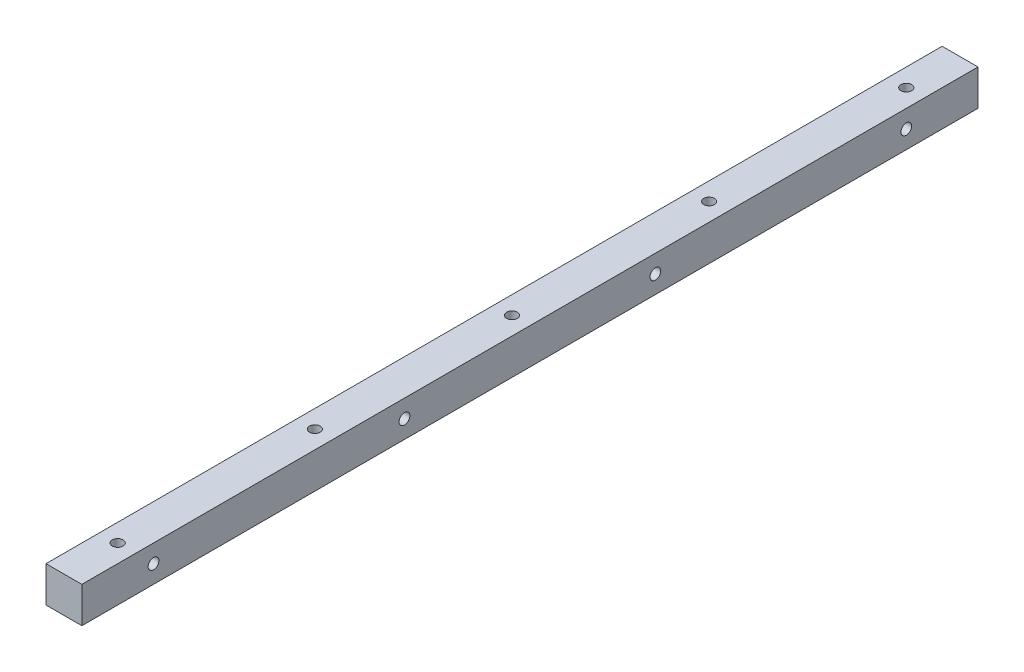
ISO-10303-21;
HEADER;
FILE_DESCRIPTION(('STEP AP214'),'2;1');
FILE_NAME('part.step','',(''),(''),'','','');
FILE_SCHEMA(('AUTOMOTIVE_DESIGN { 1 0 10303 214 1 1 1 1 }'));
ENDSEC;
DATA;
#1=APPLICATION_CONTEXT('core data for automotive mechanical design processes');
#2=APPLICATION_PROTOCOL_DEFINITION('international standard','automotive_design',2000,#1);
#3=PRODUCT_CONTEXT('',#1,'mechanical');
#4=PRODUCT('Part','Part','',(#3));
#5=PRODUCT_RELATED_PRODUCT_CATEGORY('part','',(#4));
#6=PRODUCT_DEFINITION_FORMATION('','',#4);
#7=PRODUCT_DEFINITION_CONTEXT('part definition',#1,'design');
#8=PRODUCT_DEFINITION('design','',#6,#7);
#9=PRODUCT_DEFINITION_SHAPE('','',#8);
#10=(LENGTH_UNIT() NAMED_UNIT(*) SI_UNIT(.MILLI.,.METRE.));
#11=(NAMED_UNIT(*) PLANE_ANGLE_UNIT() SI_UNIT($,.RADIAN.));
#12=(NAMED_UNIT(*) SI_UNIT($,.STERADIAN.) SOLID_ANGLE_UNIT());
#13=UNCERTAINTY_MEASURE_WITH_UNIT(LENGTH_MEASURE(1.E-05),#10,'distance_accuracy_value','');
#14=(GEOMETRIC_REPRESENTATION_CONTEXT(3) GLOBAL_UNCERTAINTY_ASSIGNED_CONTEXT((#13)) GLOBAL_UNIT_ASSIGNED_CONTEXT((#10,
#11,#12)) REPRESENTATION_CONTEXT('',''));
#15=CARTESIAN_POINT('',(0.,0.,0.));
#16=DIRECTION('',(0.,0.,1.));
#17=DIRECTION('',(1.,0.,0.));
#18=AXIS2_PLACEMENT_3D('',#15,#16,#17);
#19=CARTESIAN_POINT('',(0.,0.,250.));
#20=DIRECTION('',(1.,0.,0.));
#21=DIRECTION('',(0.,0.,-1.));
#22=AXIS2_PLACEMENT_3D('',#19,#20,#21);
#23=PLANE('',#22);
#24=CARTESIAN_POINT('',(0.,5.,160.));
#25=DIRECTION('',(-1.,0.,0.));
#26=DIRECTION('',(0.,0.,1.));
#27=AXIS2_PLACEMENT_3D('',#24,#25,#26);
#28=CIRCLE('',#27,1.5);
#29=CARTESIAN_POINT('',(0.,5.,161.5));
#30=VERTEX_POINT('',#29);
#31=EDGE_CURVE('E293',#30,#30,#28,.T.);
#32=ORIENTED_EDGE('',*,*,#31,.F.);
#33=EDGE_LOOP('',(#32));
#34=FACE_BOUND('',#33,.T.);
#35=CARTESIAN_POINT('',(0.,5.,230.));
#36=DIRECTION('',(-1.,0.,0.));
#37=DIRECTION('',(0.,0.,1.));
#38=AXIS2_PLACEMENT_3D('',#35,#36,#37);
#39=CIRCLE('',#38,1.5);
#40=CARTESIAN_POINT('',(0.,5.,231.5));
#41=VERTEX_POINT('',#40);
#42=EDGE_CURVE('E287',#41,#41,#39,.T.);
#43=ORIENTED_EDGE('',*,*,#42,.F.);
#44=EDGE_LOOP('',(#43));
#45=FACE_BOUND('',#44,.T.);
#46=CARTESIAN_POINT('',(0.,5.,90.));
#47=DIRECTION('',(-1.,0.,0.));
#48=DIRECTION('',(0.,0.,1.));
#49=AXIS2_PLACEMENT_3D('',#46,#47,#48);
#50=CIRCLE('',#49,1.5);
#51=CARTESIAN_POINT('',(0.,5.,91.5));
#52=VERTEX_POINT('',#51);
#53=EDGE_CURVE('E281',#52,#52,#50,.T.);
#54=ORIENTED_EDGE('',*,*,#53,.F.);
#55=EDGE_LOOP('',(#54));
#56=FACE_BOUND('',#55,.T.);
#57=CARTESIAN_POINT('',(0.,5.,20.));
#58=DIRECTION('',(-1.,0.,0.));
#59=DIRECTION('',(0.,0.,1.));
#60=AXIS2_PLACEMENT_3D('',#57,#58,#59);
#61=CIRCLE('',#60,1.5);
#62=CARTESIAN_POINT('',(0.,5.,21.5));
#63=VERTEX_POINT('',#62);
#64=EDGE_CURVE('E275',#63,#63,#61,.T.);
#65=ORIENTED_EDGE('',*,*,#64,.F.);
#66=EDGE_LOOP('',(#65));
#67=FACE_BOUND('',#66,.T.);
#68=DIRECTION('',(0.,-1.,0.));
#69=VECTOR('',#68,1.);
#70=CARTESIAN_POINT('',(0.,0.,0.));
#71=LINE('',#70,#69);
#72=CARTESIAN_POINT('',(0.,10.,0.));
#73=VERTEX_POINT('',#72);
#74=CARTESIAN_POINT('',(0.,0.,0.));
#75=VERTEX_POINT('',#74);
#76=EDGE_CURVE('E84',#73,#75,#71,.T.);
#77=ORIENTED_EDGE('',*,*,#76,.T.);
#78=DIRECTION('',(0.,0.,-1.));
#79=VECTOR('',#78,1.);
#80=CARTESIAN_POINT('',(0.,0.,250.));
#81=LINE('',#80,#79);
#82=CARTESIAN_POINT('',(0.,0.,250.));
#83=VERTEX_POINT('',#82);
#84=EDGE_CURVE('E91',#83,#75,#81,.T.);
#85=ORIENTED_EDGE('',*,*,#84,.F.);
#86=DIRECTION('',(0.,-1.,0.));
#87=VECTOR('',#86,1.);
#88=CARTESIAN_POINT('',(0.,0.,250.));
#89=LINE('',#88,#87);
#90=CARTESIAN_POINT('',(0.,10.,250.));
#91=VERTEX_POINT('',#90);
#92=EDGE_CURVE('E112',#91,#83,#89,.T.);
#93=ORIENTED_EDGE('',*,*,#92,.F.);
#94=DIRECTION('',(0.,0.,-1.));
#95=VECTOR('',#94,1.);
#96=CARTESIAN_POINT('',(0.,10.,250.));
#97=LINE('',#96,#95);
#98=EDGE_CURVE('E101',#91,#73,#97,.T.);
#99=ORIENTED_EDGE('',*,*,#98,.T.);
#100=EDGE_LOOP('',(#77,#85,#93,#99));
#101=FACE_BOUND('',#100,.T.);
#102=ADVANCED_FACE('F38',(#34,#45,#56,#67,#101),#23,.F.);
#103=CARTESIAN_POINT('',(0.,0.,250.));
#104=DIRECTION('',(0.,1.,0.));
#105=DIRECTION('',(0.,0.,1.));
#106=AXIS2_PLACEMENT_3D('',#103,#104,#105);
#107=PLANE('',#106);
#108=CARTESIAN_POINT('',(5.,0.,70.));
#109=DIRECTION('',(0.,1.,0.));
#110=DIRECTION('',(0.,0.,1.));
#111=AXIS2_PLACEMENT_3D('',#108,#109,#110);
#112=CIRCLE('',#111,1.5);
#113=CARTESIAN_POINT('',(5.,0.,71.5));
#114=VERTEX_POINT('',#113);
#115=EDGE_CURVE('E267',#114,#114,#112,.T.);
#116=ORIENTED_EDGE('',*,*,#115,.T.);
#117=EDGE_LOOP('',(#116));
#118=FACE_BOUND('',#117,.T.);
#119=CARTESIAN_POINT('',(5.,0.,15.));
#120=DIRECTION('',(0.,1.,0.));
#121=DIRECTION('',(0.,0.,1.));
#122=AXIS2_PLACEMENT_3D('',#119,#120,#121);
#123=CIRCLE('',#122,1.5);
#124=CARTESIAN_POINT('',(5.,0.,16.5));
#125=VERTEX_POINT('',#124);
#126=EDGE_CURVE('E102',#125,#125,#123,.T.);
#127=ORIENTED_EDGE('',*,*,#126,.T.);
#128=EDGE_LOOP('',(#127));
#129=FACE_BOUND('',#128,.T.);
#130=DIRECTION('',(1.,0.,0.));
#131=VECTOR('',#130,1.);
#132=CARTESIAN_POINT('',(0.,0.,0.));
#133=LINE('',#132,#131);
#134=CARTESIAN_POINT('',(10.,0.,0.));
#135=VERTEX_POINT('',#134);
#136=EDGE_CURVE('E79',#75,#135,#133,.T.);
#137=ORIENTED_EDGE('',*,*,#136,.T.);
#138=DIRECTION('',(0.,0.,-1.));
#139=VECTOR('',#138,1.);
#140=CARTESIAN_POINT('',(10.,0.,250.));
#141=LINE('',#140,#139);
#142=CARTESIAN_POINT('',(10.,0.,250.));
#143=VERTEX_POINT('',#142);
#144=EDGE_CURVE('E98',#143,#135,#141,.T.);
#145=ORIENTED_EDGE('',*,*,#144,.F.);
#146=DIRECTION('',(1.,0.,0.));
#147=VECTOR('',#146,1.);
#148=CARTESIAN_POINT('',(0.,0.,250.));
#149=LINE('',#148,#147);
#150=EDGE_CURVE('E94',#83,#143,#149,.T.);
#151=ORIENTED_EDGE('',*,*,#150,.F.);
#152=ORIENTED_EDGE('',*,*,#84,.T.);
#153=EDGE_LOOP('',(#137,#145,#151,#152));
#154=FACE_BOUND('',#153,.T.);
#155=CARTESIAN_POINT('',(5.,0.,125.));
#156=DIRECTION('',(0.,1.,0.));
#157=DIRECTION('',(0.,0.,1.));
#158=AXIS2_PLACEMENT_3D('',#155,#156,#157);
#159=CIRCLE('',#158,1.5);
#160=CARTESIAN_POINT('',(5.,0.,126.5));
#161=VERTEX_POINT('',#160);
#162=EDGE_CURVE('E97',#161,#161,#159,.T.);
#163=ORIENTED_EDGE('',*,*,#162,.T.);
#164=EDGE_LOOP('',(#163));
#165=FACE_BOUND('',#164,.T.);
#166=CARTESIAN_POINT('',(5.,0.,180.));
#167=DIRECTION('',(0.,1.,0.));
#168=DIRECTION('',(0.,0.,1.));
#169=AXIS2_PLACEMENT_3D('',#166,#167,#168);
#170=CIRCLE('',#169,1.5);
#171=CARTESIAN_POINT('',(5.,0.,181.5));
#172=VERTEX_POINT('',#171);
#173=EDGE_CURVE('E127',#172,#172,#170,.T.);
#174=ORIENTED_EDGE('',*,*,#173,.T.);
#175=EDGE_LOOP('',(#174));
#176=FACE_BOUND('',#175,.T.);
#177=CARTESIAN_POINT('',(5.,0.,235.));
#178=DIRECTION('',(0.,1.,0.));
#179=DIRECTION('',(0.,0.,1.));
#180=AXIS2_PLACEMENT_3D('',#177,#178,#179);
#181=CIRCLE('',#180,1.5);
#182=CARTESIAN_POINT('',(5.,0.,236.5));
#183=VERTEX_POINT('',#182);
#184=EDGE_CURVE('E46',#183,#183,#181,.T.);
#185=ORIENTED_EDGE('',*,*,#184,.T.);
#186=EDGE_LOOP('',(#185));
#187=FACE_BOUND('',#186,.T.);
#188=ADVANCED_FACE('F92',(#118,#129,#154,#165,#176,#187),#107,.F.);
#189=CARTESIAN_POINT('',(10.,0.,250.));
#190=DIRECTION('',(-1.,0.,0.));
#191=DIRECTION('',(0.,-1.,0.));
#192=AXIS2_PLACEMENT_3D('',#189,#190,#191);
#193=PLANE('',#192);
#194=CARTESIAN_POINT('',(10.,5.,160.));
#195=DIRECTION('',(-1.,0.,0.));
#196=DIRECTION('',(0.,0.,1.));
#197=AXIS2_PLACEMENT_3D('',#194,#195,#196);
#198=CIRCLE('',#197,1.5);
#199=CARTESIAN_POINT('',(10.,5.,161.5));
#200=VERTEX_POINT('',#199);
#201=EDGE_CURVE('E290',#200,#200,#198,.T.);
#202=ORIENTED_EDGE('',*,*,#201,.T.);
#203=EDGE_LOOP('',(#202));
#204=FACE_BOUND('',#203,.T.);
#205=CARTESIAN_POINT('',(10.,5.,230.));
#206=DIRECTION('',(-1.,0.,0.));
#207=DIRECTION('',(0.,0.,1.));
#208=AXIS2_PLACEMENT_3D('',#205,#206,#207);
#209=CIRCLE('',#208,1.5);
#210=CARTESIAN_POINT('',(10.,5.,231.5));
#211=VERTEX_POINT('',#210);
#212=EDGE_CURVE('E284',#211,#211,#209,.T.);
#213=ORIENTED_EDGE('',*,*,#212,.T.);
#214=EDGE_LOOP('',(#213));
#215=FACE_BOUND('',#214,.T.);
#216=CARTESIAN_POINT('',(10.,5.,90.));
#217=DIRECTION('',(-1.,0.,0.));
#218=DIRECTION('',(0.,0.,1.));
#219=AXIS2_PLACEMENT_3D('',#216,#217,#218);
#220=CIRCLE('',#219,1.5);
#221=CARTESIAN_POINT('',(10.,5.,91.5));
#222=VERTEX_POINT('',#221);
#223=EDGE_CURVE('E278',#222,#222,#220,.T.);
#224=ORIENTED_EDGE('',*,*,#223,.T.);
#225=EDGE_LOOP('',(#224));
#226=FACE_BOUND('',#225,.T.);
#227=CARTESIAN_POINT('',(10.,5.,20.));
#228=DIRECTION('',(-1.,0.,0.));
#229=DIRECTION('',(0.,0.,1.));
#230=AXIS2_PLACEMENT_3D('',#227,#228,#229);
#231=CIRCLE('',#230,1.5);
#232=CARTESIAN_POINT('',(10.,5.,21.5));
#233=VERTEX_POINT('',#232);
#234=EDGE_CURVE('E272',#233,#233,#231,.T.);
#235=ORIENTED_EDGE('',*,*,#234,.T.);
#236=EDGE_LOOP('',(#235));
#237=FACE_BOUND('',#236,.T.);
#238=DIRECTION('',(0.,1.,0.));
#239=VECTOR('',#238,1.);
#240=CARTESIAN_POINT('',(10.,0.,0.));
#241=LINE('',#240,#239);
#242=CARTESIAN_POINT('',(10.,10.,0.));
#243=VERTEX_POINT('',#242);
#244=EDGE_CURVE('E85',#135,#243,#241,.T.);
#245=ORIENTED_EDGE('',*,*,#244,.T.);
#246=DIRECTION('',(0.,0.,-1.));
#247=VECTOR('',#246,1.);
#248=CARTESIAN_POINT('',(10.,10.,250.));
#249=LINE('',#248,#247);
#250=CARTESIAN_POINT('',(10.,10.,250.));
#251=VERTEX_POINT('',#250);
#252=EDGE_CURVE('E118',#251,#243,#249,.T.);
#253=ORIENTED_EDGE('',*,*,#252,.F.);
#254=DIRECTION('',(0.,1.,0.));
#255=VECTOR('',#254,1.);
#256=CARTESIAN_POINT('',(10.,0.,250.));
#257=LINE('',#256,#255);
#258=EDGE_CURVE('E58',#143,#251,#257,.T.);
#259=ORIENTED_EDGE('',*,*,#258,.F.);
#260=ORIENTED_EDGE('',*,*,#144,.T.);
#261=EDGE_LOOP('',(#245,#253,#259,#260));
#262=FACE_BOUND('',#261,.T.);
#263=ADVANCED_FACE('F145',(#204,#215,#226,#237,#262),#193,.F.);
#264=CARTESIAN_POINT('',(0.,10.,250.));
#265=DIRECTION('',(0.,-1.,0.));
#266=DIRECTION('',(0.,0.,-1.));
#267=AXIS2_PLACEMENT_3D('',#264,#265,#266);
#268=PLANE('',#267);
#269=CARTESIAN_POINT('',(5.,10.,70.));
#270=DIRECTION('',(0.,1.,0.));
#271=DIRECTION('',(0.,0.,1.));
#272=AXIS2_PLACEMENT_3D('',#269,#270,#271);
#273=CIRCLE('',#272,1.5);
#274=CARTESIAN_POINT('',(5.,10.,71.5));
#275=VERTEX_POINT('',#274);
#276=EDGE_CURVE('E265',#275,#275,#273,.T.);
#277=ORIENTED_EDGE('',*,*,#276,.F.);
#278=EDGE_LOOP('',(#277));
#279=FACE_BOUND('',#278,.T.);
#280=CARTESIAN_POINT('',(5.,10.,15.));
#281=DIRECTION('',(0.,1.,0.));
#282=DIRECTION('',(0.,0.,1.));
#283=AXIS2_PLACEMENT_3D('',#280,#281,#282);
#284=CIRCLE('',#283,1.5);
#285=CARTESIAN_POINT('',(5.,10.,16.5));
#286=VERTEX_POINT('',#285);
#287=EDGE_CURVE('E105',#286,#286,#284,.T.);
#288=ORIENTED_EDGE('',*,*,#287,.F.);
#289=EDGE_LOOP('',(#288));
#290=FACE_BOUND('',#289,.T.);
#291=DIRECTION('',(-1.,0.,0.));
#292=VECTOR('',#291,1.);
#293=CARTESIAN_POINT('',(0.,10.,0.));
#294=LINE('',#293,#292);
#295=EDGE_CURVE('E110',#243,#73,#294,.T.);
#296=ORIENTED_EDGE('',*,*,#295,.T.);
#297=ORIENTED_EDGE('',*,*,#98,.F.);
#298=DIRECTION('',(-1.,0.,0.));
#299=VECTOR('',#298,1.);
#300=CARTESIAN_POINT('',(0.,10.,250.));
#301=LINE('',#300,#299);
#302=EDGE_CURVE('E53',#251,#91,#301,.T.);
#303=ORIENTED_EDGE('',*,*,#302,.F.);
#304=ORIENTED_EDGE('',*,*,#252,.T.);
#305=EDGE_LOOP('',(#296,#297,#303,#304));
#306=FACE_BOUND('',#305,.T.);
#307=CARTESIAN_POINT('',(5.,10.,125.));
#308=DIRECTION('',(0.,1.,0.));
#309=DIRECTION('',(0.,0.,1.));
#310=AXIS2_PLACEMENT_3D('',#307,#308,#309);
#311=CIRCLE('',#310,1.5);
#312=CARTESIAN_POINT('',(5.,10.,126.5));
#313=VERTEX_POINT('',#312);
#314=EDGE_CURVE('E124',#313,#313,#311,.T.);
#315=ORIENTED_EDGE('',*,*,#314,.F.);
#316=EDGE_LOOP('',(#315));
#317=FACE_BOUND('',#316,.T.);
#318=CARTESIAN_POINT('',(5.,10.,180.));
#319=DIRECTION('',(0.,1.,0.));
#320=DIRECTION('',(0.,0.,1.));
#321=AXIS2_PLACEMENT_3D('',#318,#319,#320);
#322=CIRCLE('',#321,1.5);
#323=CARTESIAN_POINT('',(5.,10.,181.5));
#324=VERTEX_POINT('',#323);
#325=EDGE_CURVE('E130',#324,#324,#322,.T.);
#326=ORIENTED_EDGE('',*,*,#325,.F.);
#327=EDGE_LOOP('',(#326));
#328=FACE_BOUND('',#327,.T.);
#329=CARTESIAN_POINT('',(5.,10.,235.));
#330=DIRECTION('',(0.,1.,0.));
#331=DIRECTION('',(0.,0.,1.));
#332=AXIS2_PLACEMENT_3D('',#329,#330,#331);
#333=CIRCLE('',#332,1.5);
#334=CARTESIAN_POINT('',(5.,10.,236.5));
#335=VERTEX_POINT('',#334);
#336=EDGE_CURVE('E13',#335,#335,#333,.T.);
#337=ORIENTED_EDGE('',*,*,#336,.F.);
#338=EDGE_LOOP('',(#337));
#339=FACE_BOUND('',#338,.T.);
#340=ADVANCED_FACE('F142',(#279,#290,#306,#317,#328,#339),#268,.F.);
#341=CARTESIAN_POINT('',(0.,10.,250.));
#342=DIRECTION('',(0.,0.,-1.));
#343=DIRECTION('',(-1.,0.,0.));
#344=AXIS2_PLACEMENT_3D('',#341,#342,#343);
#345=PLANE('',#344);
#346=ORIENTED_EDGE('',*,*,#92,.T.);
#347=ORIENTED_EDGE('',*,*,#150,.T.);
#348=ORIENTED_EDGE('',*,*,#258,.T.);
#349=ORIENTED_EDGE('',*,*,#302,.T.);
#350=EDGE_LOOP('',(#346,#347,#348,#349));
#351=FACE_BOUND('',#350,.T.);
#352=ADVANCED_FACE('F144',(#351),#345,.F.);
#353=CARTESIAN_POINT('',(0.,10.,0.));
#354=DIRECTION('',(0.,0.,-1.));
#355=DIRECTION('',(-1.,0.,0.));
#356=AXIS2_PLACEMENT_3D('',#353,#354,#355);
#357=PLANE('',#356);
#358=ORIENTED_EDGE('',*,*,#76,.F.);
#359=ORIENTED_EDGE('',*,*,#295,.F.);
#360=ORIENTED_EDGE('',*,*,#244,.F.);
#361=ORIENTED_EDGE('',*,*,#136,.F.);
#362=EDGE_LOOP('',(#358,#359,#360,#361));
#363=FACE_BOUND('',#362,.T.);
#364=ADVANCED_FACE('F81',(#363),#357,.T.);
#365=CARTESIAN_POINT('',(5.,0.,15.));
#366=DIRECTION('',(0.,1.,0.));
#367=DIRECTION('',(0.,0.,1.));
#368=AXIS2_PLACEMENT_3D('',#365,#366,#367);
#369=CYLINDRICAL_SURFACE('',#368,1.5);
#370=ORIENTED_EDGE('',*,*,#126,.F.);
#371=EDGE_LOOP('',(#370));
#372=FACE_BOUND('',#371,.T.);
#373=ORIENTED_EDGE('',*,*,#287,.T.);
#374=EDGE_LOOP('',(#373));
#375=FACE_BOUND('',#374,.T.);
#376=ADVANCED_FACE('F225',(#372,#375),#369,.F.);
#377=CARTESIAN_POINT('',(5.,0.,70.));
#378=DIRECTION('',(0.,1.,0.));
#379=DIRECTION('',(0.,0.,1.));
#380=AXIS2_PLACEMENT_3D('',#377,#378,#379);
#381=CYLINDRICAL_SURFACE('',#380,1.5);
#382=ORIENTED_EDGE('',*,*,#115,.F.);
#383=EDGE_LOOP('',(#382));
#384=FACE_BOUND('',#383,.T.);
#385=ORIENTED_EDGE('',*,*,#276,.T.);
#386=EDGE_LOOP('',(#385));
#387=FACE_BOUND('',#386,.T.);
#388=ADVANCED_FACE('F171',(#384,#387),#381,.F.);
#389=CARTESIAN_POINT('',(5.,0.,125.));
#390=DIRECTION('',(0.,1.,0.));
#391=DIRECTION('',(0.,0.,1.));
#392=AXIS2_PLACEMENT_3D('',#389,#390,#391);
#393=CYLINDRICAL_SURFACE('',#392,1.5);
#394=ORIENTED_EDGE('',*,*,#162,.F.);
#395=EDGE_LOOP('',(#394));
#396=FACE_BOUND('',#395,.T.);
#397=ORIENTED_EDGE('',*,*,#314,.T.);
#398=EDGE_LOOP('',(#397));
#399=FACE_BOUND('',#398,.T.);
#400=ADVANCED_FACE('F169',(#396,#399),#393,.F.);
#401=CARTESIAN_POINT('',(5.,0.,180.));
#402=DIRECTION('',(0.,1.,0.));
#403=DIRECTION('',(0.,0.,1.));
#404=AXIS2_PLACEMENT_3D('',#401,#402,#403);
#405=CYLINDRICAL_SURFACE('',#404,1.5);
#406=ORIENTED_EDGE('',*,*,#173,.F.);
#407=EDGE_LOOP('',(#406));
#408=FACE_BOUND('',#407,.T.);
#409=ORIENTED_EDGE('',*,*,#325,.T.);
#410=EDGE_LOOP('',(#409));
#411=FACE_BOUND('',#410,.T.);
#412=ADVANCED_FACE('F139',(#408,#411),#405,.F.);
#413=CARTESIAN_POINT('',(5.,0.,235.));
#414=DIRECTION('',(0.,1.,0.));
#415=DIRECTION('',(0.,0.,1.));
#416=AXIS2_PLACEMENT_3D('',#413,#414,#415);
#417=CYLINDRICAL_SURFACE('',#416,1.5);
#418=ORIENTED_EDGE('',*,*,#184,.F.);
#419=EDGE_LOOP('',(#418));
#420=FACE_BOUND('',#419,.T.);
#421=ORIENTED_EDGE('',*,*,#336,.T.);
#422=EDGE_LOOP('',(#421));
#423=FACE_BOUND('',#422,.T.);
#424=ADVANCED_FACE('F40',(#420,#423),#417,.F.);
#425=CARTESIAN_POINT('',(10.,5.,20.));
#426=DIRECTION('',(-1.,0.,0.));
#427=DIRECTION('',(0.,0.,1.));
#428=AXIS2_PLACEMENT_3D('',#425,#426,#427);
#429=CYLINDRICAL_SURFACE('',#428,1.5);
#430=ORIENTED_EDGE('',*,*,#234,.F.);
#431=EDGE_LOOP('',(#430));
#432=FACE_BOUND('',#431,.T.);
#433=ORIENTED_EDGE('',*,*,#64,.T.);
#434=EDGE_LOOP('',(#433));
#435=FACE_BOUND('',#434,.T.);
#436=ADVANCED_FACE('F138',(#432,#435),#429,.F.);
#437=CARTESIAN_POINT('',(10.,5.,90.));
#438=DIRECTION('',(-1.,0.,0.));
#439=DIRECTION('',(0.,0.,1.));
#440=AXIS2_PLACEMENT_3D('',#437,#438,#439);
#441=CYLINDRICAL_SURFACE('',#440,1.5);
#442=ORIENTED_EDGE('',*,*,#223,.F.);
#443=EDGE_LOOP('',(#442));
#444=FACE_BOUND('',#443,.T.);
#445=ORIENTED_EDGE('',*,*,#53,.T.);
#446=EDGE_LOOP('',(#445));
#447=FACE_BOUND('',#446,.T.);
#448=ADVANCED_FACE('F195',(#444,#447),#441,.F.);
#449=CARTESIAN_POINT('',(10.,5.,230.));
#450=DIRECTION('',(-1.,0.,0.));
#451=DIRECTION('',(0.,0.,1.));
#452=AXIS2_PLACEMENT_3D('',#449,#450,#451);
#453=CYLINDRICAL_SURFACE('',#452,1.5);
#454=ORIENTED_EDGE('',*,*,#212,.F.);
#455=EDGE_LOOP('',(#454));
#456=FACE_BOUND('',#455,.T.);
#457=ORIENTED_EDGE('',*,*,#42,.T.);
#458=EDGE_LOOP('',(#457));
#459=FACE_BOUND('',#458,.T.);
#460=ADVANCED_FACE('F203',(#456,#459),#453,.F.);
#461=CARTESIAN_POINT('',(10.,5.,160.));
#462=DIRECTION('',(-1.,0.,0.));
#463=DIRECTION('',(0.,0.,1.));
#464=AXIS2_PLACEMENT_3D('',#461,#462,#463);
#465=CYLINDRICAL_SURFACE('',#464,1.5);
#466=ORIENTED_EDGE('',*,*,#201,.F.);
#467=EDGE_LOOP('',(#466));
#468=FACE_BOUND('',#467,.T.);
#469=ORIENTED_EDGE('',*,*,#31,.T.);
#470=EDGE_LOOP('',(#469));
#471=FACE_BOUND('',#470,.T.);
#472=ADVANCED_FACE('F211',(#468,#471),#465,.F.);
#473=CLOSED_SHELL('',(#102,#188,#263,#340,#352,#364,#376,#388,#400,#412,#424,#436,#448,#460,#472));
#474=MANIFOLD_SOLID_BREP('B2',#473);
#475=ADVANCED_BREP_SHAPE_REPRESENTATION('',(#18,#474),#14);
#476=SHAPE_DEFINITION_REPRESENTATION(#9,#475);
ENDSEC;
END-ISO-10303-21;
